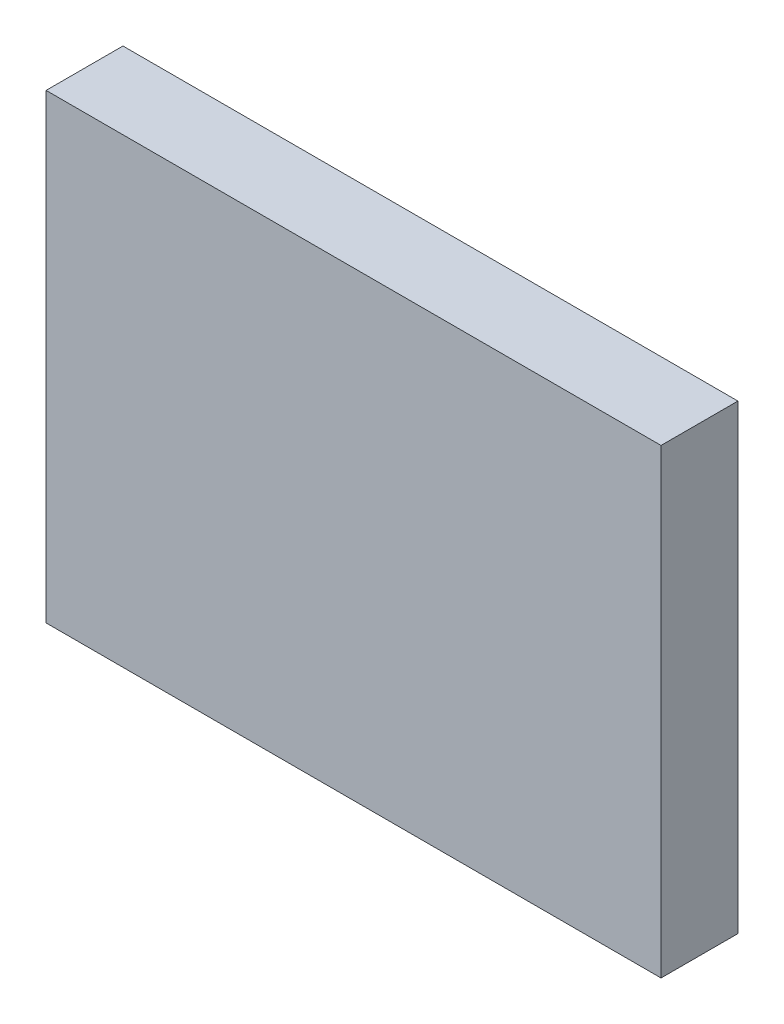
ISO-10303-21;
HEADER;
FILE_DESCRIPTION(('STEP AP214'),'2;1');
FILE_NAME('part.step','',(''),(''),'','','');
FILE_SCHEMA(('AUTOMOTIVE_DESIGN { 1 0 10303 214 1 1 1 1 }'));
ENDSEC;
DATA;
#1=APPLICATION_CONTEXT('core data for automotive mechanical design processes');
#2=APPLICATION_PROTOCOL_DEFINITION('international standard','automotive_design',2000,#1);
#3=PRODUCT_CONTEXT('',#1,'mechanical');
#4=PRODUCT('Part','Part','',(#3));
#5=PRODUCT_RELATED_PRODUCT_CATEGORY('part','',(#4));
#6=PRODUCT_DEFINITION_FORMATION('','',#4);
#7=PRODUCT_DEFINITION_CONTEXT('part definition',#1,'design');
#8=PRODUCT_DEFINITION('design','',#6,#7);
#9=PRODUCT_DEFINITION_SHAPE('','',#8);
#10=(LENGTH_UNIT() NAMED_UNIT(*) SI_UNIT(.MILLI.,.METRE.));
#11=(NAMED_UNIT(*) PLANE_ANGLE_UNIT() SI_UNIT($,.RADIAN.));
#12=(NAMED_UNIT(*) SI_UNIT($,.STERADIAN.) SOLID_ANGLE_UNIT());
#13=UNCERTAINTY_MEASURE_WITH_UNIT(LENGTH_MEASURE(1.E-05),#10,'distance_accuracy_value','');
#14=(GEOMETRIC_REPRESENTATION_CONTEXT(3) GLOBAL_UNCERTAINTY_ASSIGNED_CONTEXT((#13)) GLOBAL_UNIT_ASSIGNED_CONTEXT((#10,
#11,#12)) REPRESENTATION_CONTEXT('',''));
#15=CARTESIAN_POINT('',(0.,0.,0.));
#16=DIRECTION('',(0.,0.,1.));
#17=DIRECTION('',(1.,0.,0.));
#18=AXIS2_PLACEMENT_3D('',#15,#16,#17);
#19=CARTESIAN_POINT('',(0.,0.,10.));
#20=DIRECTION('',(1.,0.,0.));
#21=DIRECTION('',(0.,0.,-1.));
#22=AXIS2_PLACEMENT_3D('',#19,#20,#21);
#23=PLANE('',#22);
#24=DIRECTION('',(0.,-1.,0.));
#25=VECTOR('',#24,1.);
#26=CARTESIAN_POINT('',(0.,0.,0.));
#27=LINE('',#26,#25);
#28=CARTESIAN_POINT('',(0.,0.,0.));
#29=VERTEX_POINT('',#28);
#30=CARTESIAN_POINT('',(0.,-60.,0.));
#31=VERTEX_POINT('',#30);
#32=EDGE_CURVE('E96',#29,#31,#27,.T.);
#33=ORIENTED_EDGE('',*,*,#32,.T.);
#34=DIRECTION('',(0.,0.,-1.));
#35=VECTOR('',#34,1.);
#36=CARTESIAN_POINT('',(0.,-60.,10.));
#37=LINE('',#36,#35);
#38=CARTESIAN_POINT('',(0.,-60.,10.));
#39=VERTEX_POINT('',#38);
#40=EDGE_CURVE('E11',#39,#31,#37,.T.);
#41=ORIENTED_EDGE('',*,*,#40,.F.);
#42=DIRECTION('',(0.,-1.,0.));
#43=VECTOR('',#42,1.);
#44=CARTESIAN_POINT('',(0.,0.,10.));
#45=LINE('',#44,#43);
#46=CARTESIAN_POINT('',(0.,0.,10.));
#47=VERTEX_POINT('',#46);
#48=EDGE_CURVE('E84',#47,#39,#45,.T.);
#49=ORIENTED_EDGE('',*,*,#48,.F.);
#50=DIRECTION('',(0.,0.,-1.));
#51=VECTOR('',#50,1.);
#52=CARTESIAN_POINT('',(0.,0.,10.));
#53=LINE('',#52,#51);
#54=EDGE_CURVE('E92',#47,#29,#53,.T.);
#55=ORIENTED_EDGE('',*,*,#54,.T.);
#56=EDGE_LOOP('',(#33,#41,#49,#55));
#57=FACE_BOUND('',#56,.T.);
#58=ADVANCED_FACE('F33',(#57),#23,.F.);
#59=CARTESIAN_POINT('',(0.,-60.,10.));
#60=DIRECTION('',(0.,1.,0.));
#61=DIRECTION('',(0.,0.,1.));
#62=AXIS2_PLACEMENT_3D('',#59,#60,#61);
#63=PLANE('',#62);
#64=DIRECTION('',(1.,0.,0.));
#65=VECTOR('',#64,1.);
#66=CARTESIAN_POINT('',(0.,-60.,0.));
#67=LINE('',#66,#65);
#68=CARTESIAN_POINT('',(80.,-60.,0.));
#69=VERTEX_POINT('',#68);
#70=EDGE_CURVE('E88',#31,#69,#67,.T.);
#71=ORIENTED_EDGE('',*,*,#70,.T.);
#72=DIRECTION('',(0.,0.,-1.));
#73=VECTOR('',#72,1.);
#74=CARTESIAN_POINT('',(80.,-60.,10.));
#75=LINE('',#74,#73);
#76=CARTESIAN_POINT('',(80.,-60.,10.));
#77=VERTEX_POINT('',#76);
#78=EDGE_CURVE('E41',#77,#69,#75,.T.);
#79=ORIENTED_EDGE('',*,*,#78,.F.);
#80=DIRECTION('',(1.,0.,0.));
#81=VECTOR('',#80,1.);
#82=CARTESIAN_POINT('',(0.,-60.,10.));
#83=LINE('',#82,#81);
#84=EDGE_CURVE('E79',#39,#77,#83,.T.);
#85=ORIENTED_EDGE('',*,*,#84,.F.);
#86=ORIENTED_EDGE('',*,*,#40,.T.);
#87=EDGE_LOOP('',(#71,#79,#85,#86));
#88=FACE_BOUND('',#87,.T.);
#89=ADVANCED_FACE('F87',(#88),#63,.F.);
#90=CARTESIAN_POINT('',(80.,0.,10.));
#91=DIRECTION('',(-1.,0.,0.));
#92=DIRECTION('',(0.,-1.,0.));
#93=AXIS2_PLACEMENT_3D('',#90,#91,#92);
#94=PLANE('',#93);
#95=DIRECTION('',(0.,1.,0.));
#96=VECTOR('',#95,1.);
#97=CARTESIAN_POINT('',(80.,0.,0.));
#98=LINE('',#97,#96);
#99=CARTESIAN_POINT('',(80.,0.,0.));
#100=VERTEX_POINT('',#99);
#101=EDGE_CURVE('E66',#69,#100,#98,.T.);
#102=ORIENTED_EDGE('',*,*,#101,.T.);
#103=DIRECTION('',(0.,0.,-1.));
#104=VECTOR('',#103,1.);
#105=CARTESIAN_POINT('',(80.,0.,10.));
#106=LINE('',#105,#104);
#107=CARTESIAN_POINT('',(80.,0.,10.));
#108=VERTEX_POINT('',#107);
#109=EDGE_CURVE('E89',#108,#100,#106,.T.);
#110=ORIENTED_EDGE('',*,*,#109,.F.);
#111=DIRECTION('',(0.,1.,0.));
#112=VECTOR('',#111,1.);
#113=CARTESIAN_POINT('',(80.,0.,10.));
#114=LINE('',#113,#112);
#115=EDGE_CURVE('E82',#77,#108,#114,.T.);
#116=ORIENTED_EDGE('',*,*,#115,.F.);
#117=ORIENTED_EDGE('',*,*,#78,.T.);
#118=EDGE_LOOP('',(#102,#110,#116,#117));
#119=FACE_BOUND('',#118,.T.);
#120=ADVANCED_FACE('F90',(#119),#94,.F.);
#121=CARTESIAN_POINT('',(0.,0.,10.));
#122=DIRECTION('',(0.,-1.,0.));
#123=DIRECTION('',(0.,0.,-1.));
#124=AXIS2_PLACEMENT_3D('',#121,#122,#123);
#125=PLANE('',#124);
#126=DIRECTION('',(-1.,0.,0.));
#127=VECTOR('',#126,1.);
#128=CARTESIAN_POINT('',(0.,0.,0.));
#129=LINE('',#128,#127);
#130=EDGE_CURVE('E72',#100,#29,#129,.T.);
#131=ORIENTED_EDGE('',*,*,#130,.T.);
#132=ORIENTED_EDGE('',*,*,#54,.F.);
#133=DIRECTION('',(-1.,0.,0.));
#134=VECTOR('',#133,1.);
#135=CARTESIAN_POINT('',(0.,0.,10.));
#136=LINE('',#135,#134);
#137=EDGE_CURVE('E49',#108,#47,#136,.T.);
#138=ORIENTED_EDGE('',*,*,#137,.F.);
#139=ORIENTED_EDGE('',*,*,#109,.T.);
#140=EDGE_LOOP('',(#131,#132,#138,#139));
#141=FACE_BOUND('',#140,.T.);
#142=ADVANCED_FACE('F103',(#141),#125,.F.);
#143=CARTESIAN_POINT('',(0.,0.,10.));
#144=DIRECTION('',(0.,0.,1.));
#145=DIRECTION('',(1.,0.,0.));
#146=AXIS2_PLACEMENT_3D('',#143,#144,#145);
#147=PLANE('',#146);
#148=ORIENTED_EDGE('',*,*,#48,.T.);
#149=ORIENTED_EDGE('',*,*,#84,.T.);
#150=ORIENTED_EDGE('',*,*,#115,.T.);
#151=ORIENTED_EDGE('',*,*,#137,.T.);
#152=EDGE_LOOP('',(#148,#149,#150,#151));
#153=FACE_BOUND('',#152,.T.);
#154=ADVANCED_FACE('F80',(#153),#147,.T.);
#155=CARTESIAN_POINT('',(0.,0.,0.));
#156=DIRECTION('',(0.,0.,1.));
#157=DIRECTION('',(1.,0.,0.));
#158=AXIS2_PLACEMENT_3D('',#155,#156,#157);
#159=PLANE('',#158);
#160=ORIENTED_EDGE('',*,*,#32,.F.);
#161=ORIENTED_EDGE('',*,*,#130,.F.);
#162=ORIENTED_EDGE('',*,*,#101,.F.);
#163=ORIENTED_EDGE('',*,*,#70,.F.);
#164=EDGE_LOOP('',(#160,#161,#162,#163));
#165=FACE_BOUND('',#164,.T.);
#166=ADVANCED_FACE('F106',(#165),#159,.F.);
#167=CLOSED_SHELL('',(#58,#89,#120,#142,#154,#166));
#168=MANIFOLD_SOLID_BREP('B2',#167);
#169=ADVANCED_BREP_SHAPE_REPRESENTATION('',(#18,#168),#14);
#170=SHAPE_DEFINITION_REPRESENTATION(#9,#169);
ENDSEC;
END-ISO-10303-21;
